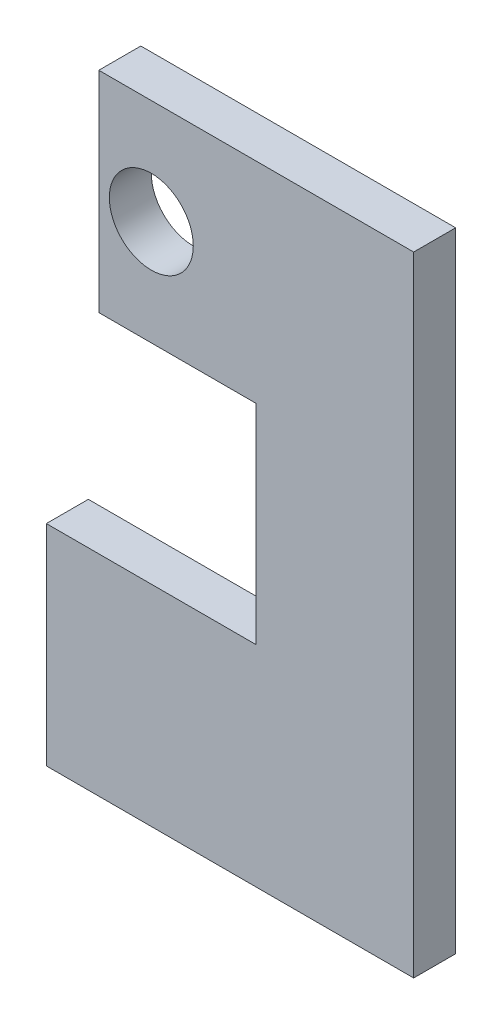
ISO-10303-21;
HEADER;
FILE_DESCRIPTION(('STEP AP214'),'2;1');
FILE_NAME('part.step','',(''),(''),'','','');
FILE_SCHEMA(('AUTOMOTIVE_DESIGN { 1 0 10303 214 1 1 1 1 }'));
ENDSEC;
DATA;
#1=APPLICATION_CONTEXT('core data for automotive mechanical design processes');
#2=APPLICATION_PROTOCOL_DEFINITION('international standard','automotive_design',2000,#1);
#3=PRODUCT_CONTEXT('',#1,'mechanical');
#4=PRODUCT('Part','Part','',(#3));
#5=PRODUCT_RELATED_PRODUCT_CATEGORY('part','',(#4));
#6=PRODUCT_DEFINITION_FORMATION('','',#4);
#7=PRODUCT_DEFINITION_CONTEXT('part definition',#1,'design');
#8=PRODUCT_DEFINITION('design','',#6,#7);
#9=PRODUCT_DEFINITION_SHAPE('','',#8);
#10=(LENGTH_UNIT() NAMED_UNIT(*) SI_UNIT(.MILLI.,.METRE.));
#11=(NAMED_UNIT(*) PLANE_ANGLE_UNIT() SI_UNIT($,.RADIAN.));
#12=(NAMED_UNIT(*) SI_UNIT($,.STERADIAN.) SOLID_ANGLE_UNIT());
#13=UNCERTAINTY_MEASURE_WITH_UNIT(LENGTH_MEASURE(1.E-05),#10,'distance_accuracy_value','');
#14=(GEOMETRIC_REPRESENTATION_CONTEXT(3) GLOBAL_UNCERTAINTY_ASSIGNED_CONTEXT((#13)) GLOBAL_UNIT_ASSIGNED_CONTEXT((#10,
#11,#12)) REPRESENTATION_CONTEXT('',''));
#15=CARTESIAN_POINT('',(0.,0.,0.));
#16=DIRECTION('',(0.,0.,1.));
#17=DIRECTION('',(1.,0.,0.));
#18=AXIS2_PLACEMENT_3D('',#15,#16,#17);
#19=CARTESIAN_POINT('',(0.,0.,20.));
#20=DIRECTION('',(0.,0.,1.));
#21=DIRECTION('',(1.,0.,0.));
#22=AXIS2_PLACEMENT_3D('',#19,#20,#21);
#23=PLANE('',#22);
#24=DIRECTION('',(0.,-1.,0.));
#25=VECTOR('',#24,1.);
#26=CARTESIAN_POINT('',(-75.,50.,20.));
#27=LINE('',#26,#25);
#28=CARTESIAN_POINT('',(-75.,50.,20.));
#29=VERTEX_POINT('',#28);
#30=CARTESIAN_POINT('',(-75.,-50.,20.));
#31=VERTEX_POINT('',#30);
#32=EDGE_CURVE('E166',#29,#31,#27,.T.);
#33=ORIENTED_EDGE('',*,*,#32,.T.);
#34=DIRECTION('',(1.,0.,0.));
#35=VECTOR('',#34,1.);
#36=CARTESIAN_POINT('',(-75.,-50.,20.));
#37=LINE('',#36,#35);
#38=CARTESIAN_POINT('',(0.,-50.,20.));
#39=VERTEX_POINT('',#38);
#40=EDGE_CURVE('E101',#31,#39,#37,.T.);
#41=ORIENTED_EDGE('',*,*,#40,.T.);
#42=DIRECTION('',(0.,-1.,0.));
#43=VECTOR('',#42,1.);
#44=CARTESIAN_POINT('',(0.,-50.,20.));
#45=LINE('',#44,#43);
#46=CARTESIAN_POINT('',(0.,-149.536956037152,20.));
#47=VERTEX_POINT('',#46);
#48=EDGE_CURVE('E187',#39,#47,#45,.T.);
#49=ORIENTED_EDGE('',*,*,#48,.T.);
#50=DIRECTION('',(-1.,0.,0.));
#51=VECTOR('',#50,1.);
#52=CARTESIAN_POINT('',(0.,-149.536956037152,20.));
#53=LINE('',#52,#51);
#54=CARTESIAN_POINT('',(-99.9999999999999,-149.536956037152,20.));
#55=VERTEX_POINT('',#54);
#56=EDGE_CURVE('E201',#47,#55,#53,.T.);
#57=ORIENTED_EDGE('',*,*,#56,.T.);
#58=DIRECTION('',(0.,-1.,0.));
#59=VECTOR('',#58,1.);
#60=CARTESIAN_POINT('',(-99.9999999999999,-149.536956037152,20.));
#61=LINE('',#60,#59);
#62=CARTESIAN_POINT('',(-99.9999999999999,-249.536956037152,20.));
#63=VERTEX_POINT('',#62);
#64=EDGE_CURVE('E120',#55,#63,#61,.T.);
#65=ORIENTED_EDGE('',*,*,#64,.T.);
#66=DIRECTION('',(1.,0.,0.));
#67=VECTOR('',#66,1.);
#68=CARTESIAN_POINT('',(-99.9999999999999,-249.536956037152,20.));
#69=LINE('',#68,#67);
#70=CARTESIAN_POINT('',(75.0000000000001,-249.536956037152,20.));
#71=VERTEX_POINT('',#70);
#72=EDGE_CURVE('E114',#63,#71,#69,.T.);
#73=ORIENTED_EDGE('',*,*,#72,.T.);
#74=DIRECTION('',(0.,1.,0.));
#75=VECTOR('',#74,1.);
#76=CARTESIAN_POINT('',(75.0000000000001,-249.536956037152,20.));
#77=LINE('',#76,#75);
#78=CARTESIAN_POINT('',(75.,50.,20.));
#79=VERTEX_POINT('',#78);
#80=EDGE_CURVE('E118',#71,#79,#77,.T.);
#81=ORIENTED_EDGE('',*,*,#80,.T.);
#82=DIRECTION('',(-1.,0.,0.));
#83=VECTOR('',#82,1.);
#84=CARTESIAN_POINT('',(-75.,50.,20.));
#85=LINE('',#84,#83);
#86=EDGE_CURVE('E59',#79,#29,#85,.T.);
#87=ORIENTED_EDGE('',*,*,#86,.T.);
#88=EDGE_LOOP('',(#33,#41,#49,#57,#65,#73,#81,#87));
#89=FACE_BOUND('',#88,.T.);
#90=CARTESIAN_POINT('',(-50.,0.,20.));
#91=DIRECTION('',(0.,0.,1.));
#92=DIRECTION('',(1.,0.,0.));
#93=AXIS2_PLACEMENT_3D('',#90,#91,#92);
#94=CIRCLE('',#93,20.);
#95=CARTESIAN_POINT('',(-30.,0.,20.));
#96=VERTEX_POINT('',#95);
#97=EDGE_CURVE('E148',#96,#96,#94,.T.);
#98=ORIENTED_EDGE('',*,*,#97,.F.);
#99=EDGE_LOOP('',(#98));
#100=FACE_BOUND('',#99,.T.);
#101=ADVANCED_FACE('F41',(#89,#100),#23,.T.);
#102=CARTESIAN_POINT('',(0.,0.,0.));
#103=DIRECTION('',(0.,0.,1.));
#104=DIRECTION('',(1.,0.,0.));
#105=AXIS2_PLACEMENT_3D('',#102,#103,#104);
#106=PLANE('',#105);
#107=DIRECTION('',(0.,-1.,0.));
#108=VECTOR('',#107,1.);
#109=CARTESIAN_POINT('',(-75.,50.,0.));
#110=LINE('',#109,#108);
#111=CARTESIAN_POINT('',(-75.,50.,0.));
#112=VERTEX_POINT('',#111);
#113=CARTESIAN_POINT('',(-75.,-50.,0.));
#114=VERTEX_POINT('',#113);
#115=EDGE_CURVE('E143',#112,#114,#110,.T.);
#116=ORIENTED_EDGE('',*,*,#115,.F.);
#117=DIRECTION('',(-1.,0.,0.));
#118=VECTOR('',#117,1.);
#119=CARTESIAN_POINT('',(-75.,50.,0.));
#120=LINE('',#119,#118);
#121=CARTESIAN_POINT('',(75.,50.,0.));
#122=VERTEX_POINT('',#121);
#123=EDGE_CURVE('E93',#122,#112,#120,.T.);
#124=ORIENTED_EDGE('',*,*,#123,.F.);
#125=DIRECTION('',(0.,1.,0.));
#126=VECTOR('',#125,1.);
#127=CARTESIAN_POINT('',(75.,50.,0.));
#128=LINE('',#127,#126);
#129=CARTESIAN_POINT('',(75.0000000000001,-249.536956037152,0.));
#130=VERTEX_POINT('',#129);
#131=EDGE_CURVE('E87',#130,#122,#128,.T.);
#132=ORIENTED_EDGE('',*,*,#131,.F.);
#133=DIRECTION('',(1.,0.,0.));
#134=VECTOR('',#133,1.);
#135=CARTESIAN_POINT('',(-99.9999999999999,-249.536956037152,0.));
#136=LINE('',#135,#134);
#137=CARTESIAN_POINT('',(-99.9999999999999,-249.536956037152,0.));
#138=VERTEX_POINT('',#137);
#139=EDGE_CURVE('E130',#138,#130,#136,.T.);
#140=ORIENTED_EDGE('',*,*,#139,.F.);
#141=DIRECTION('',(0.,-1.,0.));
#142=VECTOR('',#141,1.);
#143=CARTESIAN_POINT('',(-99.9999999999999,-149.536956037152,0.));
#144=LINE('',#143,#142);
#145=CARTESIAN_POINT('',(-99.9999999999999,-149.536956037152,0.));
#146=VERTEX_POINT('',#145);
#147=EDGE_CURVE('E157',#146,#138,#144,.T.);
#148=ORIENTED_EDGE('',*,*,#147,.F.);
#149=DIRECTION('',(-1.,0.,0.));
#150=VECTOR('',#149,1.);
#151=CARTESIAN_POINT('',(0.,-149.536956037152,0.));
#152=LINE('',#151,#150);
#153=CARTESIAN_POINT('',(0.,-149.536956037152,0.));
#154=VERTEX_POINT('',#153);
#155=EDGE_CURVE('E154',#154,#146,#152,.T.);
#156=ORIENTED_EDGE('',*,*,#155,.F.);
#157=DIRECTION('',(0.,-1.,0.));
#158=VECTOR('',#157,1.);
#159=CARTESIAN_POINT('',(0.,-50.,0.));
#160=LINE('',#159,#158);
#161=CARTESIAN_POINT('',(0.,-50.,0.));
#162=VERTEX_POINT('',#161);
#163=EDGE_CURVE('E151',#162,#154,#160,.T.);
#164=ORIENTED_EDGE('',*,*,#163,.F.);
#165=DIRECTION('',(1.,0.,0.));
#166=VECTOR('',#165,1.);
#167=CARTESIAN_POINT('',(-75.,-50.,0.));
#168=LINE('',#167,#166);
#169=EDGE_CURVE('E147',#114,#162,#168,.T.);
#170=ORIENTED_EDGE('',*,*,#169,.F.);
#171=EDGE_LOOP('',(#116,#124,#132,#140,#148,#156,#164,#170));
#172=FACE_BOUND('',#171,.T.);
#173=CARTESIAN_POINT('',(-50.,0.,0.));
#174=DIRECTION('',(0.,0.,1.));
#175=DIRECTION('',(1.,0.,0.));
#176=AXIS2_PLACEMENT_3D('',#173,#174,#175);
#177=CIRCLE('',#176,20.);
#178=CARTESIAN_POINT('',(-30.,0.,0.));
#179=VERTEX_POINT('',#178);
#180=EDGE_CURVE('E211',#179,#179,#177,.T.);
#181=ORIENTED_EDGE('',*,*,#180,.T.);
#182=EDGE_LOOP('',(#181));
#183=FACE_BOUND('',#182,.T.);
#184=ADVANCED_FACE('F191',(#172,#183),#106,.F.);
#185=CARTESIAN_POINT('',(-75.,50.,20.));
#186=DIRECTION('',(1.,0.,0.));
#187=DIRECTION('',(0.,0.,-1.));
#188=AXIS2_PLACEMENT_3D('',#185,#186,#187);
#189=PLANE('',#188);
#190=ORIENTED_EDGE('',*,*,#115,.T.);
#191=DIRECTION('',(0.,0.,-1.));
#192=VECTOR('',#191,1.);
#193=CARTESIAN_POINT('',(-75.,-50.,20.));
#194=LINE('',#193,#192);
#195=EDGE_CURVE('E11',#31,#114,#194,.T.);
#196=ORIENTED_EDGE('',*,*,#195,.F.);
#197=ORIENTED_EDGE('',*,*,#32,.F.);
#198=DIRECTION('',(0.,0.,-1.));
#199=VECTOR('',#198,1.);
#200=CARTESIAN_POINT('',(-75.,50.,20.));
#201=LINE('',#200,#199);
#202=EDGE_CURVE('E139',#29,#112,#201,.T.);
#203=ORIENTED_EDGE('',*,*,#202,.T.);
#204=EDGE_LOOP('',(#190,#196,#197,#203));
#205=FACE_BOUND('',#204,.T.);
#206=ADVANCED_FACE('F43',(#205),#189,.F.);
#207=CARTESIAN_POINT('',(-75.,-50.,20.));
#208=DIRECTION('',(0.,1.,0.));
#209=DIRECTION('',(0.,0.,1.));
#210=AXIS2_PLACEMENT_3D('',#207,#208,#209);
#211=PLANE('',#210);
#212=ORIENTED_EDGE('',*,*,#169,.T.);
#213=DIRECTION('',(0.,0.,-1.));
#214=VECTOR('',#213,1.);
#215=CARTESIAN_POINT('',(0.,-50.,20.));
#216=LINE('',#215,#214);
#217=EDGE_CURVE('E51',#39,#162,#216,.T.);
#218=ORIENTED_EDGE('',*,*,#217,.F.);
#219=ORIENTED_EDGE('',*,*,#40,.F.);
#220=ORIENTED_EDGE('',*,*,#195,.T.);
#221=EDGE_LOOP('',(#212,#218,#219,#220));
#222=FACE_BOUND('',#221,.T.);
#223=ADVANCED_FACE('F241',(#222),#211,.F.);
#224=CARTESIAN_POINT('',(0.,-50.,20.));
#225=DIRECTION('',(1.,0.,0.));
#226=DIRECTION('',(0.,1.,0.));
#227=AXIS2_PLACEMENT_3D('',#224,#225,#226);
#228=PLANE('',#227);
#229=ORIENTED_EDGE('',*,*,#163,.T.);
#230=DIRECTION('',(0.,0.,-1.));
#231=VECTOR('',#230,1.);
#232=CARTESIAN_POINT('',(0.,-149.536956037152,20.));
#233=LINE('',#232,#231);
#234=EDGE_CURVE('E177',#47,#154,#233,.T.);
#235=ORIENTED_EDGE('',*,*,#234,.F.);
#236=ORIENTED_EDGE('',*,*,#48,.F.);
#237=ORIENTED_EDGE('',*,*,#217,.T.);
#238=EDGE_LOOP('',(#229,#235,#236,#237));
#239=FACE_BOUND('',#238,.T.);
#240=ADVANCED_FACE('F185',(#239),#228,.F.);
#241=CARTESIAN_POINT('',(0.,-149.536956037152,20.));
#242=DIRECTION('',(0.,-1.,0.));
#243=DIRECTION('',(1.,0.,0.));
#244=AXIS2_PLACEMENT_3D('',#241,#242,#243);
#245=PLANE('',#244);
#246=ORIENTED_EDGE('',*,*,#155,.T.);
#247=DIRECTION('',(0.,0.,-1.));
#248=VECTOR('',#247,1.);
#249=CARTESIAN_POINT('',(-99.9999999999999,-149.536956037152,20.));
#250=LINE('',#249,#248);
#251=EDGE_CURVE('E173',#55,#146,#250,.T.);
#252=ORIENTED_EDGE('',*,*,#251,.F.);
#253=ORIENTED_EDGE('',*,*,#56,.F.);
#254=ORIENTED_EDGE('',*,*,#234,.T.);
#255=EDGE_LOOP('',(#246,#252,#253,#254));
#256=FACE_BOUND('',#255,.T.);
#257=ADVANCED_FACE('F196',(#256),#245,.F.);
#258=CARTESIAN_POINT('',(-99.9999999999999,-149.536956037152,20.));
#259=DIRECTION('',(1.,0.,0.));
#260=DIRECTION('',(0.,1.,0.));
#261=AXIS2_PLACEMENT_3D('',#258,#259,#260);
#262=PLANE('',#261);
#263=ORIENTED_EDGE('',*,*,#147,.T.);
#264=DIRECTION('',(0.,0.,-1.));
#265=VECTOR('',#264,1.);
#266=CARTESIAN_POINT('',(-99.9999999999999,-249.536956037152,20.));
#267=LINE('',#266,#265);
#268=EDGE_CURVE('E132',#63,#138,#267,.T.);
#269=ORIENTED_EDGE('',*,*,#268,.F.);
#270=ORIENTED_EDGE('',*,*,#64,.F.);
#271=ORIENTED_EDGE('',*,*,#251,.T.);
#272=EDGE_LOOP('',(#263,#269,#270,#271));
#273=FACE_BOUND('',#272,.T.);
#274=ADVANCED_FACE('F199',(#273),#262,.F.);
#275=CARTESIAN_POINT('',(-99.9999999999999,-249.536956037152,20.));
#276=DIRECTION('',(0.,1.,0.));
#277=DIRECTION('',(0.,0.,1.));
#278=AXIS2_PLACEMENT_3D('',#275,#276,#277);
#279=PLANE('',#278);
#280=ORIENTED_EDGE('',*,*,#139,.T.);
#281=DIRECTION('',(0.,0.,-1.));
#282=VECTOR('',#281,1.);
#283=CARTESIAN_POINT('',(75.0000000000001,-249.536956037152,20.));
#284=LINE('',#283,#282);
#285=EDGE_CURVE('E127',#71,#130,#284,.T.);
#286=ORIENTED_EDGE('',*,*,#285,.F.);
#287=ORIENTED_EDGE('',*,*,#72,.F.);
#288=ORIENTED_EDGE('',*,*,#268,.T.);
#289=EDGE_LOOP('',(#280,#286,#287,#288));
#290=FACE_BOUND('',#289,.T.);
#291=ADVANCED_FACE('F128',(#290),#279,.F.);
#292=CARTESIAN_POINT('',(75.,50.,20.));
#293=DIRECTION('',(-1.,0.,0.));
#294=DIRECTION('',(0.,-1.,0.));
#295=AXIS2_PLACEMENT_3D('',#292,#293,#294);
#296=PLANE('',#295);
#297=ORIENTED_EDGE('',*,*,#131,.T.);
#298=DIRECTION('',(0.,0.,-1.));
#299=VECTOR('',#298,1.);
#300=CARTESIAN_POINT('',(75.,50.,20.));
#301=LINE('',#300,#299);
#302=EDGE_CURVE('E133',#79,#122,#301,.T.);
#303=ORIENTED_EDGE('',*,*,#302,.F.);
#304=ORIENTED_EDGE('',*,*,#80,.F.);
#305=ORIENTED_EDGE('',*,*,#285,.T.);
#306=EDGE_LOOP('',(#297,#303,#304,#305));
#307=FACE_BOUND('',#306,.T.);
#308=ADVANCED_FACE('F135',(#307),#296,.F.);
#309=CARTESIAN_POINT('',(-75.,50.,20.));
#310=DIRECTION('',(0.,-1.,0.));
#311=DIRECTION('',(0.,0.,-1.));
#312=AXIS2_PLACEMENT_3D('',#309,#310,#311);
#313=PLANE('',#312);
#314=ORIENTED_EDGE('',*,*,#123,.T.);
#315=ORIENTED_EDGE('',*,*,#202,.F.);
#316=ORIENTED_EDGE('',*,*,#86,.F.);
#317=ORIENTED_EDGE('',*,*,#302,.T.);
#318=EDGE_LOOP('',(#314,#315,#316,#317));
#319=FACE_BOUND('',#318,.T.);
#320=ADVANCED_FACE('F229',(#319),#313,.F.);
#321=CARTESIAN_POINT('',(-50.,0.,20.));
#322=DIRECTION('',(0.,0.,-1.));
#323=DIRECTION('',(-1.,0.,0.));
#324=AXIS2_PLACEMENT_3D('',#321,#322,#323);
#325=CYLINDRICAL_SURFACE('',#324,20.);
#326=ORIENTED_EDGE('',*,*,#97,.T.);
#327=EDGE_LOOP('',(#326));
#328=FACE_BOUND('',#327,.T.);
#329=ORIENTED_EDGE('',*,*,#180,.F.);
#330=EDGE_LOOP('',(#329));
#331=FACE_BOUND('',#330,.T.);
#332=ADVANCED_FACE('F219',(#328,#331),#325,.F.);
#333=CLOSED_SHELL('',(#101,#184,#206,#223,#240,#257,#274,#291,#308,#320,#332));
#334=MANIFOLD_SOLID_BREP('B2',#333);
#335=ADVANCED_BREP_SHAPE_REPRESENTATION('',(#18,#334),#14);
#336=SHAPE_DEFINITION_REPRESENTATION(#9,#335);
ENDSEC;
END-ISO-10303-21;
